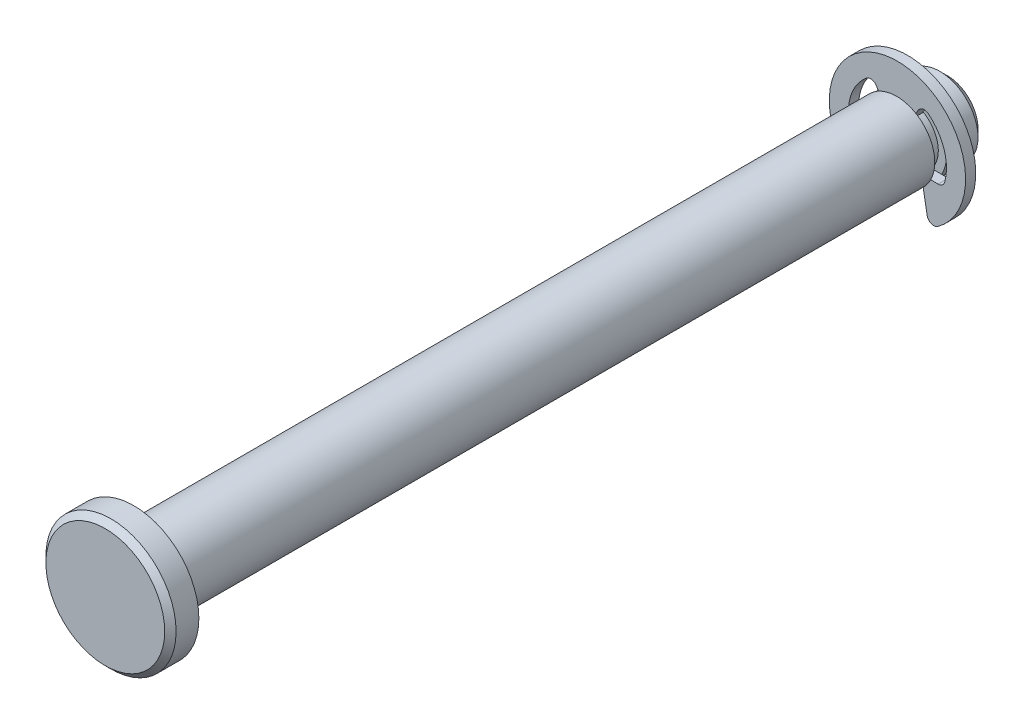
ISO-10303-21;
HEADER;
FILE_DESCRIPTION(('STEP AP214'),'2;1');
FILE_NAME('part.step','',(''),(''),'','','');
FILE_SCHEMA(('AUTOMOTIVE_DESIGN { 1 0 10303 214 1 1 1 1 }'));
ENDSEC;
DATA;
#1=APPLICATION_CONTEXT('core data for automotive mechanical design processes');
#2=APPLICATION_PROTOCOL_DEFINITION('international standard','automotive_design',2000,#1);
#3=PRODUCT_CONTEXT('',#1,'mechanical');
#4=PRODUCT('Part','Part','',(#3));
#5=PRODUCT_RELATED_PRODUCT_CATEGORY('part','',(#4));
#6=PRODUCT_DEFINITION_FORMATION('','',#4);
#7=PRODUCT_DEFINITION_CONTEXT('part definition',#1,'design');
#8=PRODUCT_DEFINITION('design','',#6,#7);
#9=PRODUCT_DEFINITION_SHAPE('','',#8);
#10=(LENGTH_UNIT() NAMED_UNIT(*) SI_UNIT(.MILLI.,.METRE.));
#11=(NAMED_UNIT(*) PLANE_ANGLE_UNIT() SI_UNIT($,.RADIAN.));
#12=(NAMED_UNIT(*) SI_UNIT($,.STERADIAN.) SOLID_ANGLE_UNIT());
#13=UNCERTAINTY_MEASURE_WITH_UNIT(LENGTH_MEASURE(1.E-05),#10,'distance_accuracy_value','');
#14=(GEOMETRIC_REPRESENTATION_CONTEXT(3) GLOBAL_UNCERTAINTY_ASSIGNED_CONTEXT((#13)) GLOBAL_UNIT_ASSIGNED_CONTEXT((#10,
#11,#12)) REPRESENTATION_CONTEXT('',''));
#15=CARTESIAN_POINT('',(0.,0.,0.));
#16=DIRECTION('',(0.,0.,1.));
#17=DIRECTION('',(1.,0.,0.));
#18=AXIS2_PLACEMENT_3D('',#15,#16,#17);
#19=CARTESIAN_POINT('',(0.,0.,-22.2758));
#20=DIRECTION('',(0.,0.,1.));
#21=DIRECTION('',(1.,0.,0.));
#22=AXIS2_PLACEMENT_3D('',#19,#20,#21);
#23=PLANE('',#22);
#24=DIRECTION('',(-0.173648177666931,0.984807753012208,0.));
#25=VECTOR('',#24,1.);
#26=CARTESIAN_POINT('',(1.25692963982568,0.22163060835344,-22.2758));
#27=LINE('',#26,#25);
#28=CARTESIAN_POINT('',(1.85256069501915,-3.15636096616503,-22.2758));
#29=VERTEX_POINT('',#28);
#30=CARTESIAN_POINT('',(1.49352,-1.12014,-22.2758));
#31=VERTEX_POINT('',#30);
#32=EDGE_CURVE('E203',#29,#31,#27,.T.);
#33=ORIENTED_EDGE('',*,*,#32,.F.);
#34=CARTESIAN_POINT('',(2.2715471535382,-3.08248234897663,-22.2758));
#35=DIRECTION('',(0.,0.,1.));
#36=DIRECTION('',(1.,0.,0.));
#37=AXIS2_PLACEMENT_3D('',#34,#35,#36);
#38=CIRCLE('',#37,0.42545);
#39=CARTESIAN_POINT('',(2.52394128170911,-3.42498038775182,-22.2758));
#40=VERTEX_POINT('',#39);
#41=EDGE_CURVE('E257',#29,#40,#38,.T.);
#42=ORIENTED_EDGE('',*,*,#41,.T.);
#43=CARTESIAN_POINT('',(0.,0.,-22.2758));
#44=DIRECTION('',(0.,0.,1.));
#45=DIRECTION('',(1.,0.,0.));
#46=AXIS2_PLACEMENT_3D('',#43,#44,#45);
#47=CIRCLE('',#46,4.2545);
#48=CARTESIAN_POINT('',(-2.52394128170911,-3.42498038775182,-22.2758));
#49=VERTEX_POINT('',#48);
#50=EDGE_CURVE('E183',#40,#49,#47,.T.);
#51=ORIENTED_EDGE('',*,*,#50,.T.);
#52=CARTESIAN_POINT('',(-2.2715471535382,-3.08248234897663,-22.2758));
#53=DIRECTION('',(0.,0.,1.));
#54=DIRECTION('',(1.,0.,0.));
#55=AXIS2_PLACEMENT_3D('',#52,#53,#54);
#56=CIRCLE('',#55,0.42545);
#57=CARTESIAN_POINT('',(-1.85256069501915,-3.15636096616503,-22.2758));
#58=VERTEX_POINT('',#57);
#59=EDGE_CURVE('E255',#49,#58,#56,.T.);
#60=ORIENTED_EDGE('',*,*,#59,.T.);
#61=DIRECTION('',(-0.173648177666931,-0.984807753012208,0.));
#62=VECTOR('',#61,1.);
#63=CARTESIAN_POINT('',(-1.25692963982568,0.22163060835344,-22.2758));
#64=LINE('',#63,#62);
#65=CARTESIAN_POINT('',(-1.49352,-1.12014,-22.2758));
#66=VERTEX_POINT('',#65);
#67=EDGE_CURVE('E199',#66,#58,#64,.T.);
#68=ORIENTED_EDGE('',*,*,#67,.F.);
#69=DIRECTION('',(1.,0.,0.));
#70=VECTOR('',#69,1.);
#71=CARTESIAN_POINT('',(0.,-1.12014,-22.2758));
#72=LINE('',#71,#70);
#73=CARTESIAN_POINT('',(-2.54203626378539,-1.12014,-22.2758));
#74=VERTEX_POINT('',#73);
#75=EDGE_CURVE('E190',#74,#66,#72,.T.);
#76=ORIENTED_EDGE('',*,*,#75,.F.);
#77=CARTESIAN_POINT('',(-2.54203626378539,-0.69469,-22.2758));
#78=DIRECTION('',(0.,0.,1.));
#79=DIRECTION('',(1.,0.,0.));
#80=AXIS2_PLACEMENT_3D('',#77,#78,#79);
#81=CIRCLE('',#80,0.42545);
#82=CARTESIAN_POINT('',(-2.95243729914352,-0.806844771084337,-22.2758));
#83=VERTEX_POINT('',#82);
#84=EDGE_CURVE('E55',#74,#83,#81,.F.);
#85=ORIENTED_EDGE('',*,*,#84,.T.);
#86=CARTESIAN_POINT('',(0.,0.,-22.2758));
#87=DIRECTION('',(0.,0.,1.));
#88=DIRECTION('',(1.,0.,0.));
#89=AXIS2_PLACEMENT_3D('',#86,#87,#88);
#90=CIRCLE('',#89,3.0607);
#91=CARTESIAN_POINT('',(-1.93820951958955,2.36880314677528,-22.2758));
#92=VERTEX_POINT('',#91);
#93=EDGE_CURVE('E215',#92,#83,#90,.T.);
#94=ORIENTED_EDGE('',*,*,#93,.F.);
#95=CARTESIAN_POINT('',(-1.66879035400345,2.03952968031481,-22.2758));
#96=DIRECTION('',(0.,0.,1.));
#97=DIRECTION('',(1.,0.,0.));
#98=AXIS2_PLACEMENT_3D('',#95,#96,#97);
#99=CIRCLE('',#98,0.42545);
#100=CARTESIAN_POINT('',(-1.30033984596336,2.25225468031482,-22.2758));
#101=VERTEX_POINT('',#100);
#102=EDGE_CURVE('E187',#92,#101,#99,.F.);
#103=ORIENTED_EDGE('',*,*,#102,.T.);
#104=DIRECTION('',(-0.500000000000002,0.866025403784438,0.));
#105=VECTOR('',#104,1.);
#106=CARTESIAN_POINT('',(0.,0.,-22.2758));
#107=LINE('',#106,#105);
#108=CARTESIAN_POINT('',(-0.933450000000003,1.61678282632517,-22.2758));
#109=VERTEX_POINT('',#108);
#110=EDGE_CURVE('E179',#109,#101,#107,.T.);
#111=ORIENTED_EDGE('',*,*,#110,.F.);
#112=DIRECTION('',(1.,0.,0.));
#113=VECTOR('',#112,1.);
#114=CARTESIAN_POINT('',(-0.933450000000003,1.61678282632517,-22.2758));
#115=LINE('',#114,#113);
#116=CARTESIAN_POINT('',(0.933450000000003,1.61678282632517,-22.2758));
#117=VERTEX_POINT('',#116);
#118=EDGE_CURVE('E163',#109,#117,#115,.T.);
#119=ORIENTED_EDGE('',*,*,#118,.T.);
#120=DIRECTION('',(-0.500000000000002,-0.866025403784438,0.));
#121=VECTOR('',#120,1.);
#122=CARTESIAN_POINT('',(0.,0.,-22.2758));
#123=LINE('',#122,#121);
#124=CARTESIAN_POINT('',(1.30033984596336,2.25225468031482,-22.2758));
#125=VERTEX_POINT('',#124);
#126=EDGE_CURVE('E213',#125,#117,#123,.T.);
#127=ORIENTED_EDGE('',*,*,#126,.F.);
#128=CARTESIAN_POINT('',(1.66879035400345,2.03952968031482,-22.2758));
#129=DIRECTION('',(0.,0.,1.));
#130=DIRECTION('',(1.,0.,0.));
#131=AXIS2_PLACEMENT_3D('',#128,#129,#130);
#132=CIRCLE('',#131,0.42545);
#133=CARTESIAN_POINT('',(1.93820951958955,2.36880314677528,-22.2758));
#134=VERTEX_POINT('',#133);
#135=EDGE_CURVE('E272',#125,#134,#132,.F.);
#136=ORIENTED_EDGE('',*,*,#135,.T.);
#137=CARTESIAN_POINT('',(0.,0.,-22.2758));
#138=DIRECTION('',(0.,0.,1.));
#139=DIRECTION('',(1.,0.,0.));
#140=AXIS2_PLACEMENT_3D('',#137,#138,#139);
#141=CIRCLE('',#140,3.0607);
#142=CARTESIAN_POINT('',(2.95243729914352,-0.806844771084337,-22.2758));
#143=VERTEX_POINT('',#142);
#144=EDGE_CURVE('E218',#143,#134,#141,.T.);
#145=ORIENTED_EDGE('',*,*,#144,.F.);
#146=CARTESIAN_POINT('',(2.54203626378539,-0.69469,-22.2758));
#147=DIRECTION('',(0.,0.,1.));
#148=DIRECTION('',(1.,0.,0.));
#149=AXIS2_PLACEMENT_3D('',#146,#147,#148);
#150=CIRCLE('',#149,0.42545);
#151=CARTESIAN_POINT('',(2.54203626378539,-1.12014,-22.2758));
#152=VERTEX_POINT('',#151);
#153=EDGE_CURVE('E268',#143,#152,#150,.F.);
#154=ORIENTED_EDGE('',*,*,#153,.T.);
#155=DIRECTION('',(1.,0.,0.));
#156=VECTOR('',#155,1.);
#157=CARTESIAN_POINT('',(0.,-1.12014,-22.2758));
#158=LINE('',#157,#156);
#159=EDGE_CURVE('E208',#31,#152,#158,.T.);
#160=ORIENTED_EDGE('',*,*,#159,.F.);
#161=EDGE_LOOP('',(#33,#42,#51,#60,#68,#76,#85,#94,#103,#111,#119,#127,#136,#145,#154,#160));
#162=FACE_BOUND('',#161,.T.);
#163=ADVANCED_FACE('F47',(#162),#23,.T.);
#164=CARTESIAN_POINT('',(0.,0.,-22.9108));
#165=DIRECTION('',(0.,0.,1.));
#166=DIRECTION('',(1.,0.,0.));
#167=AXIS2_PLACEMENT_3D('',#164,#165,#166);
#168=PLANE('',#167);
#169=CARTESIAN_POINT('',(0.,0.,-22.9108));
#170=DIRECTION('',(0.,0.,1.));
#171=DIRECTION('',(1.,0.,0.));
#172=AXIS2_PLACEMENT_3D('',#169,#170,#171);
#173=CIRCLE('',#172,4.2545);
#174=CARTESIAN_POINT('',(2.52394128170911,-3.42498038775182,-22.9108));
#175=VERTEX_POINT('',#174);
#176=CARTESIAN_POINT('',(-2.52394128170911,-3.42498038775182,-22.9108));
#177=VERTEX_POINT('',#176);
#178=EDGE_CURVE('E221',#175,#177,#173,.T.);
#179=ORIENTED_EDGE('',*,*,#178,.F.);
#180=CARTESIAN_POINT('',(2.2715471535382,-3.08248234897663,-22.9108));
#181=DIRECTION('',(0.,0.,1.));
#182=DIRECTION('',(1.,0.,0.));
#183=AXIS2_PLACEMENT_3D('',#180,#181,#182);
#184=CIRCLE('',#183,0.42545);
#185=CARTESIAN_POINT('',(1.85256069501915,-3.15636096616503,-22.9108));
#186=VERTEX_POINT('',#185);
#187=EDGE_CURVE('E265',#175,#186,#184,.F.);
#188=ORIENTED_EDGE('',*,*,#187,.T.);
#189=DIRECTION('',(-0.173648177666931,0.984807753012208,0.));
#190=VECTOR('',#189,1.);
#191=CARTESIAN_POINT('',(1.25692963982568,0.22163060835344,-22.9108));
#192=LINE('',#191,#190);
#193=CARTESIAN_POINT('',(1.49352,-1.12014,-22.9108));
#194=VERTEX_POINT('',#193);
#195=EDGE_CURVE('E201',#186,#194,#192,.T.);
#196=ORIENTED_EDGE('',*,*,#195,.T.);
#197=DIRECTION('',(1.,0.,0.));
#198=VECTOR('',#197,1.);
#199=CARTESIAN_POINT('',(0.,-1.12014,-22.9108));
#200=LINE('',#199,#198);
#201=CARTESIAN_POINT('',(2.54203626378539,-1.12014,-22.9108));
#202=VERTEX_POINT('',#201);
#203=EDGE_CURVE('E205',#194,#202,#200,.T.);
#204=ORIENTED_EDGE('',*,*,#203,.T.);
#205=CARTESIAN_POINT('',(2.54203626378539,-0.69469,-22.9108));
#206=DIRECTION('',(0.,0.,1.));
#207=DIRECTION('',(1.,0.,0.));
#208=AXIS2_PLACEMENT_3D('',#205,#206,#207);
#209=CIRCLE('',#208,0.42545);
#210=CARTESIAN_POINT('',(2.95243729914352,-0.806844771084337,-22.9108));
#211=VERTEX_POINT('',#210);
#212=EDGE_CURVE('E270',#202,#211,#209,.T.);
#213=ORIENTED_EDGE('',*,*,#212,.T.);
#214=CARTESIAN_POINT('',(0.,0.,-22.9108));
#215=DIRECTION('',(0.,0.,1.));
#216=DIRECTION('',(1.,0.,0.));
#217=AXIS2_PLACEMENT_3D('',#214,#215,#216);
#218=CIRCLE('',#217,3.0607);
#219=CARTESIAN_POINT('',(1.93820951958955,2.36880314677528,-22.9108));
#220=VERTEX_POINT('',#219);
#221=EDGE_CURVE('E229',#211,#220,#218,.T.);
#222=ORIENTED_EDGE('',*,*,#221,.T.);
#223=CARTESIAN_POINT('',(1.66879035400345,2.03952968031482,-22.9108));
#224=DIRECTION('',(0.,0.,1.));
#225=DIRECTION('',(1.,0.,0.));
#226=AXIS2_PLACEMENT_3D('',#223,#224,#225);
#227=CIRCLE('',#226,0.42545);
#228=CARTESIAN_POINT('',(1.30033984596336,2.25225468031482,-22.9108));
#229=VERTEX_POINT('',#228);
#230=EDGE_CURVE('E274',#220,#229,#227,.T.);
#231=ORIENTED_EDGE('',*,*,#230,.T.);
#232=DIRECTION('',(-0.500000000000002,-0.866025403784438,0.));
#233=VECTOR('',#232,1.);
#234=CARTESIAN_POINT('',(0.,0.,-22.9108));
#235=LINE('',#234,#233);
#236=CARTESIAN_POINT('',(0.933450000000003,1.61678282632517,-22.9108));
#237=VERTEX_POINT('',#236);
#238=EDGE_CURVE('E211',#229,#237,#235,.T.);
#239=ORIENTED_EDGE('',*,*,#238,.T.);
#240=DIRECTION('',(-1.,0.,0.));
#241=VECTOR('',#240,1.);
#242=CARTESIAN_POINT('',(-0.933450000000003,1.61678282632517,-22.9108));
#243=LINE('',#242,#241);
#244=CARTESIAN_POINT('',(-0.933450000000003,1.61678282632517,-22.9108));
#245=VERTEX_POINT('',#244);
#246=EDGE_CURVE('E174',#237,#245,#243,.T.);
#247=ORIENTED_EDGE('',*,*,#246,.T.);
#248=DIRECTION('',(-0.500000000000002,0.866025403784438,0.));
#249=VECTOR('',#248,1.);
#250=CARTESIAN_POINT('',(0.,0.,-22.9108));
#251=LINE('',#250,#249);
#252=CARTESIAN_POINT('',(-1.30033984596336,2.25225468031482,-22.9108));
#253=VERTEX_POINT('',#252);
#254=EDGE_CURVE('E182',#245,#253,#251,.T.);
#255=ORIENTED_EDGE('',*,*,#254,.T.);
#256=CARTESIAN_POINT('',(-1.66879035400345,2.03952968031481,-22.9108));
#257=DIRECTION('',(0.,0.,1.));
#258=DIRECTION('',(1.,0.,0.));
#259=AXIS2_PLACEMENT_3D('',#256,#257,#258);
#260=CIRCLE('',#259,0.42545);
#261=CARTESIAN_POINT('',(-1.93820951958955,2.36880314677528,-22.9108));
#262=VERTEX_POINT('',#261);
#263=EDGE_CURVE('E277',#253,#262,#260,.T.);
#264=ORIENTED_EDGE('',*,*,#263,.T.);
#265=CARTESIAN_POINT('',(0.,0.,-22.9108));
#266=DIRECTION('',(0.,0.,1.));
#267=DIRECTION('',(1.,0.,0.));
#268=AXIS2_PLACEMENT_3D('',#265,#266,#267);
#269=CIRCLE('',#268,3.0607);
#270=CARTESIAN_POINT('',(-2.95243729914352,-0.806844771084337,-22.9108));
#271=VERTEX_POINT('',#270);
#272=EDGE_CURVE('E226',#262,#271,#269,.T.);
#273=ORIENTED_EDGE('',*,*,#272,.T.);
#274=CARTESIAN_POINT('',(-2.54203626378539,-0.69469,-22.9108));
#275=DIRECTION('',(0.,0.,1.));
#276=DIRECTION('',(1.,0.,0.));
#277=AXIS2_PLACEMENT_3D('',#274,#275,#276);
#278=CIRCLE('',#277,0.42545);
#279=CARTESIAN_POINT('',(-2.54203626378539,-1.12014,-22.9108));
#280=VERTEX_POINT('',#279);
#281=EDGE_CURVE('E12',#271,#280,#278,.T.);
#282=ORIENTED_EDGE('',*,*,#281,.T.);
#283=DIRECTION('',(1.,0.,0.));
#284=VECTOR('',#283,1.);
#285=CARTESIAN_POINT('',(0.,-1.12014,-22.9108));
#286=LINE('',#285,#284);
#287=CARTESIAN_POINT('',(-1.49352,-1.12014,-22.9108));
#288=VERTEX_POINT('',#287);
#289=EDGE_CURVE('E188',#280,#288,#286,.T.);
#290=ORIENTED_EDGE('',*,*,#289,.T.);
#291=DIRECTION('',(-0.173648177666931,-0.984807753012208,0.));
#292=VECTOR('',#291,1.);
#293=CARTESIAN_POINT('',(-1.25692963982568,0.22163060835344,-22.9108));
#294=LINE('',#293,#292);
#295=CARTESIAN_POINT('',(-1.85256069501915,-3.15636096616503,-22.9108));
#296=VERTEX_POINT('',#295);
#297=EDGE_CURVE('E197',#288,#296,#294,.T.);
#298=ORIENTED_EDGE('',*,*,#297,.T.);
#299=CARTESIAN_POINT('',(-2.2715471535382,-3.08248234897663,-22.9108));
#300=DIRECTION('',(0.,0.,1.));
#301=DIRECTION('',(1.,0.,0.));
#302=AXIS2_PLACEMENT_3D('',#299,#300,#301);
#303=CIRCLE('',#302,0.42545);
#304=EDGE_CURVE('E69',#296,#177,#303,.F.);
#305=ORIENTED_EDGE('',*,*,#304,.T.);
#306=EDGE_LOOP('',(#179,#188,#196,#204,#213,#222,#231,#239,#247,#255,#264,#273,#282,#290,#298,#305));
#307=FACE_BOUND('',#306,.T.);
#308=ADVANCED_FACE('F290',(#307),#168,.F.);
#309=CARTESIAN_POINT('',(0.,0.,-22.2758));
#310=DIRECTION('',(0.,0.,-1.));
#311=DIRECTION('',(-1.,0.,0.));
#312=AXIS2_PLACEMENT_3D('',#309,#310,#311);
#313=CYLINDRICAL_SURFACE('',#312,4.2545);
#314=ORIENTED_EDGE('',*,*,#50,.F.);
#315=DIRECTION('',(0.,0.,-1.));
#316=VECTOR('',#315,1.);
#317=CARTESIAN_POINT('',(2.52394128170911,-3.42498038775182,-22.2758));
#318=LINE('',#317,#316);
#319=EDGE_CURVE('E262',#40,#175,#318,.T.);
#320=ORIENTED_EDGE('',*,*,#319,.T.);
#321=ORIENTED_EDGE('',*,*,#178,.T.);
#322=DIRECTION('',(0.,0.,-1.));
#323=VECTOR('',#322,1.);
#324=CARTESIAN_POINT('',(-2.52394128170911,-3.42498038775182,-22.2758));
#325=LINE('',#324,#323);
#326=EDGE_CURVE('E259',#177,#49,#325,.F.);
#327=ORIENTED_EDGE('',*,*,#326,.T.);
#328=EDGE_LOOP('',(#314,#320,#321,#327));
#329=FACE_BOUND('',#328,.T.);
#330=ADVANCED_FACE('F330',(#329),#313,.T.);
#331=CARTESIAN_POINT('',(-1.49352,-1.12014,-25.4));
#332=DIRECTION('',(-0.984807753012208,0.173648177666931,0.));
#333=DIRECTION('',(-0.173648177666931,-0.984807753012208,0.));
#334=AXIS2_PLACEMENT_3D('',#331,#332,#333);
#335=PLANE('',#334);
#336=ORIENTED_EDGE('',*,*,#67,.T.);
#337=DIRECTION('',(0.,0.,-1.));
#338=VECTOR('',#337,1.);
#339=CARTESIAN_POINT('',(-1.85256069501915,-3.15636096616503,-25.4));
#340=LINE('',#339,#338);
#341=EDGE_CURVE('E62',#58,#296,#340,.T.);
#342=ORIENTED_EDGE('',*,*,#341,.T.);
#343=ORIENTED_EDGE('',*,*,#297,.F.);
#344=DIRECTION('',(0.,0.,1.));
#345=VECTOR('',#344,1.);
#346=CARTESIAN_POINT('',(-1.49352,-1.12014,-25.4));
#347=LINE('',#346,#345);
#348=EDGE_CURVE('E295',#288,#66,#347,.T.);
#349=ORIENTED_EDGE('',*,*,#348,.T.);
#350=EDGE_LOOP('',(#336,#342,#343,#349));
#351=FACE_BOUND('',#350,.T.);
#352=ADVANCED_FACE('F335',(#351),#335,.F.);
#353=CARTESIAN_POINT('',(-1.53035,2.65064395336303,-25.4));
#354=DIRECTION('',(0.866025403784438,0.500000000000002,0.));
#355=DIRECTION('',(-0.500000000000002,0.866025403784438,0.));
#356=AXIS2_PLACEMENT_3D('',#353,#354,#355);
#357=PLANE('',#356);
#358=ORIENTED_EDGE('',*,*,#110,.T.);
#359=DIRECTION('',(0.,0.,-1.));
#360=VECTOR('',#359,1.);
#361=CARTESIAN_POINT('',(-1.30033984596336,2.25225468031482,-22.9108));
#362=LINE('',#361,#360);
#363=EDGE_CURVE('E247',#101,#253,#362,.T.);
#364=ORIENTED_EDGE('',*,*,#363,.T.);
#365=ORIENTED_EDGE('',*,*,#254,.F.);
#366=DIRECTION('',(0.,0.,-1.));
#367=VECTOR('',#366,1.);
#368=CARTESIAN_POINT('',(-0.933450000000003,1.61678282632517,-22.2758));
#369=LINE('',#368,#367);
#370=EDGE_CURVE('E167',#245,#109,#369,.F.);
#371=ORIENTED_EDGE('',*,*,#370,.T.);
#372=EDGE_LOOP('',(#358,#364,#365,#371));
#373=FACE_BOUND('',#372,.T.);
#374=ADVANCED_FACE('F178',(#373),#357,.F.);
#375=CARTESIAN_POINT('',(0.,0.,-25.4));
#376=DIRECTION('',(0.,0.,1.));
#377=DIRECTION('',(1.,0.,0.));
#378=AXIS2_PLACEMENT_3D('',#375,#376,#377);
#379=CYLINDRICAL_SURFACE('',#378,3.0607);
#380=ORIENTED_EDGE('',*,*,#272,.F.);
#381=DIRECTION('',(0.,0.,1.));
#382=VECTOR('',#381,1.);
#383=CARTESIAN_POINT('',(-1.93820951958955,2.36880314677528,-25.4));
#384=LINE('',#383,#382);
#385=EDGE_CURVE('E244',#262,#92,#384,.T.);
#386=ORIENTED_EDGE('',*,*,#385,.T.);
#387=ORIENTED_EDGE('',*,*,#93,.T.);
#388=DIRECTION('',(0.,0.,1.));
#389=VECTOR('',#388,1.);
#390=CARTESIAN_POINT('',(-2.95243729914352,-0.806844771084337,-25.4));
#391=LINE('',#390,#389);
#392=EDGE_CURVE('E242',#83,#271,#391,.F.);
#393=ORIENTED_EDGE('',*,*,#392,.T.);
#394=EDGE_LOOP('',(#380,#386,#387,#393));
#395=FACE_BOUND('',#394,.T.);
#396=ADVANCED_FACE('F285',(#395),#379,.F.);
#397=CARTESIAN_POINT('',(-2.84836284036989,-1.12014,-25.4));
#398=DIRECTION('',(0.,-1.,0.));
#399=DIRECTION('',(0.,0.,-1.));
#400=AXIS2_PLACEMENT_3D('',#397,#398,#399);
#401=PLANE('',#400);
#402=ORIENTED_EDGE('',*,*,#289,.F.);
#403=DIRECTION('',(0.,0.,-1.));
#404=VECTOR('',#403,1.);
#405=CARTESIAN_POINT('',(-2.54203626378539,-1.12014,-22.2758));
#406=LINE('',#405,#404);
#407=EDGE_CURVE('E249',#280,#74,#406,.F.);
#408=ORIENTED_EDGE('',*,*,#407,.T.);
#409=ORIENTED_EDGE('',*,*,#75,.T.);
#410=ORIENTED_EDGE('',*,*,#348,.F.);
#411=EDGE_LOOP('',(#402,#408,#409,#410));
#412=FACE_BOUND('',#411,.T.);
#413=ADVANCED_FACE('F293',(#412),#401,.F.);
#414=CARTESIAN_POINT('',(0.,0.,-25.4));
#415=DIRECTION('',(0.,0.,1.));
#416=DIRECTION('',(1.,0.,0.));
#417=AXIS2_PLACEMENT_3D('',#414,#415,#416);
#418=CYLINDRICAL_SURFACE('',#417,3.0607);
#419=ORIENTED_EDGE('',*,*,#221,.F.);
#420=DIRECTION('',(0.,0.,1.));
#421=VECTOR('',#420,1.);
#422=CARTESIAN_POINT('',(2.95243729914352,-0.806844771084337,-25.4));
#423=LINE('',#422,#421);
#424=EDGE_CURVE('E234',#211,#143,#423,.T.);
#425=ORIENTED_EDGE('',*,*,#424,.T.);
#426=ORIENTED_EDGE('',*,*,#144,.T.);
#427=DIRECTION('',(0.,0.,1.));
#428=VECTOR('',#427,1.);
#429=CARTESIAN_POINT('',(1.93820951958955,2.36880314677528,-25.4));
#430=LINE('',#429,#428);
#431=EDGE_CURVE('E232',#134,#220,#430,.F.);
#432=ORIENTED_EDGE('',*,*,#431,.T.);
#433=EDGE_LOOP('',(#419,#425,#426,#432));
#434=FACE_BOUND('',#433,.T.);
#435=ADVANCED_FACE('F309',(#434),#418,.F.);
#436=CARTESIAN_POINT('',(1.49352,-1.12014,-25.4));
#437=DIRECTION('',(0.,-1.,0.));
#438=DIRECTION('',(0.,0.,-1.));
#439=AXIS2_PLACEMENT_3D('',#436,#437,#438);
#440=PLANE('',#439);
#441=ORIENTED_EDGE('',*,*,#159,.T.);
#442=DIRECTION('',(0.,0.,-1.));
#443=VECTOR('',#442,1.);
#444=CARTESIAN_POINT('',(2.54203626378539,-1.12014,-22.9108));
#445=LINE('',#444,#443);
#446=EDGE_CURVE('E237',#152,#202,#445,.T.);
#447=ORIENTED_EDGE('',*,*,#446,.T.);
#448=ORIENTED_EDGE('',*,*,#203,.F.);
#449=DIRECTION('',(0.,0.,1.));
#450=VECTOR('',#449,1.);
#451=CARTESIAN_POINT('',(1.49352,-1.12014,-25.4));
#452=LINE('',#451,#450);
#453=EDGE_CURVE('E192',#194,#31,#452,.T.);
#454=ORIENTED_EDGE('',*,*,#453,.T.);
#455=EDGE_LOOP('',(#441,#447,#448,#454));
#456=FACE_BOUND('',#455,.T.);
#457=ADVANCED_FACE('F319',(#456),#440,.F.);
#458=CARTESIAN_POINT('',(1.49352,-1.12014,-25.4));
#459=DIRECTION('',(0.984807753012208,0.173648177666931,0.));
#460=DIRECTION('',(-0.173648177666931,0.984807753012208,0.));
#461=AXIS2_PLACEMENT_3D('',#458,#459,#460);
#462=PLANE('',#461);
#463=ORIENTED_EDGE('',*,*,#195,.F.);
#464=DIRECTION('',(0.,0.,-1.));
#465=VECTOR('',#464,1.);
#466=CARTESIAN_POINT('',(1.85256069501915,-3.15636096616503,-25.4));
#467=LINE('',#466,#465);
#468=EDGE_CURVE('E252',#186,#29,#467,.F.);
#469=ORIENTED_EDGE('',*,*,#468,.T.);
#470=ORIENTED_EDGE('',*,*,#32,.T.);
#471=ORIENTED_EDGE('',*,*,#453,.F.);
#472=EDGE_LOOP('',(#463,#469,#470,#471));
#473=FACE_BOUND('',#472,.T.);
#474=ADVANCED_FACE('F324',(#473),#462,.F.);
#475=CARTESIAN_POINT('',(0.,0.,-25.4));
#476=DIRECTION('',(-0.866025403784438,0.500000000000002,0.));
#477=DIRECTION('',(-0.500000000000002,-0.866025403784438,0.));
#478=AXIS2_PLACEMENT_3D('',#475,#476,#477);
#479=PLANE('',#478);
#480=ORIENTED_EDGE('',*,*,#238,.F.);
#481=DIRECTION('',(0.,0.,-1.));
#482=VECTOR('',#481,1.);
#483=CARTESIAN_POINT('',(1.30033984596336,2.25225468031482,-22.2758));
#484=LINE('',#483,#482);
#485=EDGE_CURVE('E239',#229,#125,#484,.F.);
#486=ORIENTED_EDGE('',*,*,#485,.T.);
#487=ORIENTED_EDGE('',*,*,#126,.T.);
#488=DIRECTION('',(0.,0.,-1.));
#489=VECTOR('',#488,1.);
#490=CARTESIAN_POINT('',(0.933450000000003,1.61678282632517,-22.2758));
#491=LINE('',#490,#489);
#492=EDGE_CURVE('E170',#117,#237,#491,.T.);
#493=ORIENTED_EDGE('',*,*,#492,.T.);
#494=EDGE_LOOP('',(#480,#486,#487,#493));
#495=FACE_BOUND('',#494,.T.);
#496=ADVANCED_FACE('F302',(#495),#479,.F.);
#497=CARTESIAN_POINT('',(-0.933450000000003,1.61678282632517,-24.7943801577228));
#498=DIRECTION('',(0.,-1.,0.));
#499=DIRECTION('',(0.,0.,-1.));
#500=AXIS2_PLACEMENT_3D('',#497,#498,#499);
#501=PLANE('',#500);
#502=ORIENTED_EDGE('',*,*,#246,.F.);
#503=ORIENTED_EDGE('',*,*,#492,.F.);
#504=ORIENTED_EDGE('',*,*,#118,.F.);
#505=ORIENTED_EDGE('',*,*,#370,.F.);
#506=EDGE_LOOP('',(#502,#503,#504,#505));
#507=FACE_BOUND('',#506,.T.);
#508=ADVANCED_FACE('F166',(#507),#501,.T.);
#509=CARTESIAN_POINT('',(2.54203626378539,-0.69469,-25.4));
#510=DIRECTION('',(0.,0.,1.));
#511=DIRECTION('',(1.,0.,0.));
#512=AXIS2_PLACEMENT_3D('',#509,#510,#511);
#513=CYLINDRICAL_SURFACE('',#512,0.42545);
#514=ORIENTED_EDGE('',*,*,#212,.F.);
#515=ORIENTED_EDGE('',*,*,#446,.F.);
#516=ORIENTED_EDGE('',*,*,#153,.F.);
#517=ORIENTED_EDGE('',*,*,#424,.F.);
#518=EDGE_LOOP('',(#514,#515,#516,#517));
#519=FACE_BOUND('',#518,.T.);
#520=ADVANCED_FACE('F315',(#519),#513,.F.);
#521=CARTESIAN_POINT('',(1.66879035400345,2.03952968031482,-25.4));
#522=DIRECTION('',(0.,0.,1.));
#523=DIRECTION('',(1.,0.,0.));
#524=AXIS2_PLACEMENT_3D('',#521,#522,#523);
#525=CYLINDRICAL_SURFACE('',#524,0.42545);
#526=ORIENTED_EDGE('',*,*,#230,.F.);
#527=ORIENTED_EDGE('',*,*,#431,.F.);
#528=ORIENTED_EDGE('',*,*,#135,.F.);
#529=ORIENTED_EDGE('',*,*,#485,.F.);
#530=EDGE_LOOP('',(#526,#527,#528,#529));
#531=FACE_BOUND('',#530,.T.);
#532=ADVANCED_FACE('F312',(#531),#525,.F.);
#533=CARTESIAN_POINT('',(-1.66879035400345,2.03952968031481,-25.4));
#534=DIRECTION('',(0.,0.,1.));
#535=DIRECTION('',(1.,0.,0.));
#536=AXIS2_PLACEMENT_3D('',#533,#534,#535);
#537=CYLINDRICAL_SURFACE('',#536,0.42545);
#538=ORIENTED_EDGE('',*,*,#263,.F.);
#539=ORIENTED_EDGE('',*,*,#363,.F.);
#540=ORIENTED_EDGE('',*,*,#102,.F.);
#541=ORIENTED_EDGE('',*,*,#385,.F.);
#542=EDGE_LOOP('',(#538,#539,#540,#541));
#543=FACE_BOUND('',#542,.T.);
#544=ADVANCED_FACE('F358',(#543),#537,.F.);
#545=CARTESIAN_POINT('',(-2.54203626378539,-0.69469,-25.4));
#546=DIRECTION('',(0.,0.,1.));
#547=DIRECTION('',(1.,0.,0.));
#548=AXIS2_PLACEMENT_3D('',#545,#546,#547);
#549=CYLINDRICAL_SURFACE('',#548,0.42545);
#550=ORIENTED_EDGE('',*,*,#281,.F.);
#551=ORIENTED_EDGE('',*,*,#392,.F.);
#552=ORIENTED_EDGE('',*,*,#84,.F.);
#553=ORIENTED_EDGE('',*,*,#407,.F.);
#554=EDGE_LOOP('',(#550,#551,#552,#553));
#555=FACE_BOUND('',#554,.T.);
#556=ADVANCED_FACE('F288',(#555),#549,.F.);
#557=CARTESIAN_POINT('',(2.2715471535382,-3.08248234897663,-22.2758));
#558=DIRECTION('',(0.,0.,-1.));
#559=DIRECTION('',(-1.,0.,0.));
#560=AXIS2_PLACEMENT_3D('',#557,#558,#559);
#561=CYLINDRICAL_SURFACE('',#560,0.42545);
#562=ORIENTED_EDGE('',*,*,#187,.F.);
#563=ORIENTED_EDGE('',*,*,#319,.F.);
#564=ORIENTED_EDGE('',*,*,#41,.F.);
#565=ORIENTED_EDGE('',*,*,#468,.F.);
#566=EDGE_LOOP('',(#562,#563,#564,#565));
#567=FACE_BOUND('',#566,.T.);
#568=ADVANCED_FACE('F333',(#567),#561,.T.);
#569=CARTESIAN_POINT('',(-2.2715471535382,-3.08248234897663,-22.2758));
#570=DIRECTION('',(0.,0.,-1.));
#571=DIRECTION('',(-1.,0.,0.));
#572=AXIS2_PLACEMENT_3D('',#569,#570,#571);
#573=CYLINDRICAL_SURFACE('',#572,0.42545);
#574=ORIENTED_EDGE('',*,*,#304,.F.);
#575=ORIENTED_EDGE('',*,*,#341,.F.);
#576=ORIENTED_EDGE('',*,*,#59,.F.);
#577=ORIENTED_EDGE('',*,*,#326,.F.);
#578=EDGE_LOOP('',(#574,#575,#576,#577));
#579=FACE_BOUND('',#578,.T.);
#580=ADVANCED_FACE('F49',(#579),#573,.T.);
#581=CLOSED_SHELL('',(#163,#308,#330,#352,#374,#396,#413,#435,#457,#474,#496,#508,#520,#532,
#544,#556,#568,#580));
#582=MANIFOLD_SOLID_BREP('B2',#581);
#583=CARTESIAN_POINT('',(0.,0.,25.4));
#584=DIRECTION('',(0.,0.,-1.));
#585=DIRECTION('',(-1.,0.,0.));
#586=AXIS2_PLACEMENT_3D('',#583,#584,#585);
#587=CYLINDRICAL_SURFACE('',#586,2.38125);
#588=CARTESIAN_POINT('',(0.,0.,25.4));
#589=DIRECTION('',(0.,0.,1.));
#590=DIRECTION('',(1.,0.,0.));
#591=AXIS2_PLACEMENT_3D('',#588,#589,#590);
#592=CIRCLE('',#591,2.38125);
#593=CARTESIAN_POINT('',(2.38125,0.,25.4));
#594=VERTEX_POINT('',#593);
#595=EDGE_CURVE('E509',#594,#594,#592,.T.);
#596=ORIENTED_EDGE('',*,*,#595,.F.);
#597=EDGE_LOOP('',(#596));
#598=FACE_BOUND('',#597,.T.);
#599=CARTESIAN_POINT('',(0.,0.,-22.225));
#600=DIRECTION('',(0.,0.,1.));
#601=DIRECTION('',(1.,0.,0.));
#602=AXIS2_PLACEMENT_3D('',#599,#600,#601);
#603=CIRCLE('',#602,2.38125);
#604=CARTESIAN_POINT('',(2.38125,0.,-22.225));
#605=VERTEX_POINT('',#604);
#606=EDGE_CURVE('E521',#605,#605,#603,.T.);
#607=ORIENTED_EDGE('',*,*,#606,.T.);
#608=EDGE_LOOP('',(#607));
#609=FACE_BOUND('',#608,.T.);
#610=ADVANCED_FACE('F489',(#598,#609),#587,.T.);
#611=CARTESIAN_POINT('',(0.,2.38125,-22.225));
#612=DIRECTION('',(0.,0.,-1.));
#613=DIRECTION('',(-1.,0.,0.));
#614=AXIS2_PLACEMENT_3D('',#611,#612,#613);
#615=PLANE('',#614);
#616=CARTESIAN_POINT('',(0.,0.,-22.225));
#617=DIRECTION('',(0.,0.,1.));
#618=DIRECTION('',(1.,0.,0.));
#619=AXIS2_PLACEMENT_3D('',#616,#617,#618);
#620=CIRCLE('',#619,1.8669);
#621=CARTESIAN_POINT('',(1.8669,0.,-22.225));
#622=VERTEX_POINT('',#621);
#623=EDGE_CURVE('E512',#622,#622,#620,.T.);
#624=ORIENTED_EDGE('',*,*,#623,.T.);
#625=EDGE_LOOP('',(#624));
#626=FACE_BOUND('',#625,.T.);
#627=ORIENTED_EDGE('',*,*,#606,.F.);
#628=EDGE_LOOP('',(#627));
#629=FACE_BOUND('',#628,.T.);
#630=ADVANCED_FACE('F539',(#626,#629),#615,.T.);
#631=CARTESIAN_POINT('',(0.,0.,25.4));
#632=DIRECTION('',(0.,0.,1.));
#633=DIRECTION('',(1.,0.,0.));
#634=AXIS2_PLACEMENT_3D('',#631,#632,#633);
#635=CYLINDRICAL_SURFACE('',#634,1.8669);
#636=CARTESIAN_POINT('',(0.,0.,-22.9616));
#637=DIRECTION('',(0.,0.,1.));
#638=DIRECTION('',(1.,0.,0.));
#639=AXIS2_PLACEMENT_3D('',#636,#637,#638);
#640=CIRCLE('',#639,1.8669);
#641=CARTESIAN_POINT('',(1.8669,0.,-22.9616));
#642=VERTEX_POINT('',#641);
#643=EDGE_CURVE('E515',#642,#642,#640,.T.);
#644=ORIENTED_EDGE('',*,*,#643,.T.);
#645=EDGE_LOOP('',(#644));
#646=FACE_BOUND('',#645,.T.);
#647=ORIENTED_EDGE('',*,*,#623,.F.);
#648=EDGE_LOOP('',(#647));
#649=FACE_BOUND('',#648,.T.);
#650=ADVANCED_FACE('F544',(#646,#649),#635,.T.);
#651=CARTESIAN_POINT('',(0.,2.38125,-22.9616));
#652=DIRECTION('',(0.,0.,1.));
#653=DIRECTION('',(1.,0.,0.));
#654=AXIS2_PLACEMENT_3D('',#651,#652,#653);
#655=PLANE('',#654);
#656=CARTESIAN_POINT('',(0.,0.,-22.9616));
#657=DIRECTION('',(0.,0.,1.));
#658=DIRECTION('',(1.,0.,0.));
#659=AXIS2_PLACEMENT_3D('',#656,#657,#658);
#660=CIRCLE('',#659,2.38125);
#661=CARTESIAN_POINT('',(2.38125,0.,-22.9616));
#662=VERTEX_POINT('',#661);
#663=EDGE_CURVE('E518',#662,#662,#660,.T.);
#664=ORIENTED_EDGE('',*,*,#663,.T.);
#665=EDGE_LOOP('',(#664));
#666=FACE_BOUND('',#665,.T.);
#667=ORIENTED_EDGE('',*,*,#643,.F.);
#668=EDGE_LOOP('',(#667));
#669=FACE_BOUND('',#668,.T.);
#670=ADVANCED_FACE('F550',(#666,#669),#655,.T.);
#671=CARTESIAN_POINT('',(0.,0.,-25.4));
#672=DIRECTION('',(0.,0.,1.));
#673=DIRECTION('',(1.,0.,0.));
#674=AXIS2_PLACEMENT_3D('',#671,#672,#673);
#675=PLANE('',#674);
#676=CARTESIAN_POINT('',(0.,0.,-25.4));
#677=DIRECTION('',(0.,0.,1.));
#678=DIRECTION('',(1.,0.,0.));
#679=AXIS2_PLACEMENT_3D('',#676,#677,#678);
#680=CIRCLE('',#679,1.905);
#681=CARTESIAN_POINT('',(1.905,0.,-25.4));
#682=VERTEX_POINT('',#681);
#683=EDGE_CURVE('E46',#682,#682,#680,.F.);
#684=ORIENTED_EDGE('',*,*,#683,.T.);
#685=EDGE_LOOP('',(#684));
#686=FACE_BOUND('',#685,.T.);
#687=ADVANCED_FACE('F555',(#686),#675,.F.);
#688=CARTESIAN_POINT('',(0.,0.,-24.92375));
#689=DIRECTION('',(0.,0.,1.));
#690=DIRECTION('',(1.,0.,0.));
#691=AXIS2_PLACEMENT_3D('',#688,#689,#690);
#692=CIRCLE('',#691,2.38125);
#693=CARTESIAN_POINT('',(2.38125,0.,-24.92375));
#694=VERTEX_POINT('',#693);
#695=EDGE_CURVE('E496',#694,#694,#692,.T.);
#696=ORIENTED_EDGE('',*,*,#695,.T.);
#697=EDGE_LOOP('',(#696));
#698=FACE_BOUND('',#697,.T.);
#699=ORIENTED_EDGE('',*,*,#663,.F.);
#700=EDGE_LOOP('',(#699));
#701=FACE_BOUND('',#700,.T.);
#702=ADVANCED_FACE('F533',(#698,#701),#587,.T.);
#703=CARTESIAN_POINT('',(0.,0.,25.4));
#704=DIRECTION('',(0.,0.,1.));
#705=DIRECTION('',(1.,0.,0.));
#706=AXIS2_PLACEMENT_3D('',#703,#704,#705);
#707=PLANE('',#706);
#708=CARTESIAN_POINT('',(0.,0.,25.4));
#709=DIRECTION('',(0.,0.,1.));
#710=DIRECTION('',(1.,0.,0.));
#711=AXIS2_PLACEMENT_3D('',#708,#709,#710);
#712=CIRCLE('',#711,4.064);
#713=CARTESIAN_POINT('',(4.064,0.,25.4));
#714=VERTEX_POINT('',#713);
#715=EDGE_CURVE('E524',#714,#714,#712,.T.);
#716=ORIENTED_EDGE('',*,*,#715,.F.);
#717=EDGE_LOOP('',(#716));
#718=FACE_BOUND('',#717,.T.);
#719=ORIENTED_EDGE('',*,*,#595,.T.);
#720=EDGE_LOOP('',(#719));
#721=FACE_BOUND('',#720,.T.);
#722=ADVANCED_FACE('F530',(#718,#721),#707,.F.);
#723=CARTESIAN_POINT('',(0.,0.,27.178));
#724=DIRECTION('',(0.,0.,-1.));
#725=DIRECTION('',(-1.,0.,0.));
#726=AXIS2_PLACEMENT_3D('',#723,#724,#725);
#727=CYLINDRICAL_SURFACE('',#726,4.064);
#728=CARTESIAN_POINT('',(0.,0.,26.8224));
#729=DIRECTION('',(0.,0.,1.));
#730=DIRECTION('',(1.,0.,0.));
#731=AXIS2_PLACEMENT_3D('',#728,#729,#730);
#732=CIRCLE('',#731,4.064);
#733=CARTESIAN_POINT('',(4.064,0.,26.8224));
#734=VERTEX_POINT('',#733);
#735=EDGE_CURVE('E500',#734,#734,#732,.F.);
#736=ORIENTED_EDGE('',*,*,#735,.T.);
#737=EDGE_LOOP('',(#736));
#738=FACE_BOUND('',#737,.T.);
#739=ORIENTED_EDGE('',*,*,#715,.T.);
#740=EDGE_LOOP('',(#739));
#741=FACE_BOUND('',#740,.T.);
#742=ADVANCED_FACE('F528',(#738,#741),#727,.T.);
#743=CARTESIAN_POINT('',(0.,0.,27.178));
#744=DIRECTION('',(0.,0.,1.));
#745=DIRECTION('',(1.,0.,0.));
#746=AXIS2_PLACEMENT_3D('',#743,#744,#745);
#747=PLANE('',#746);
#748=CARTESIAN_POINT('',(0.,0.,27.178));
#749=DIRECTION('',(0.,0.,1.));
#750=DIRECTION('',(1.,0.,0.));
#751=AXIS2_PLACEMENT_3D('',#748,#749,#750);
#752=CIRCLE('',#751,3.7084);
#753=CARTESIAN_POINT('',(3.7084,0.,27.178));
#754=VERTEX_POINT('',#753);
#755=EDGE_CURVE('E504',#754,#754,#752,.T.);
#756=ORIENTED_EDGE('',*,*,#755,.T.);
#757=EDGE_LOOP('',(#756));
#758=FACE_BOUND('',#757,.T.);
#759=ADVANCED_FACE('F559',(#758),#747,.T.);
#760=CARTESIAN_POINT('',(0.,0.,27.178));
#761=DIRECTION('',(0.,0.,-1.));
#762=DIRECTION('',(-1.,0.,0.));
#763=AXIS2_PLACEMENT_3D('',#760,#761,#762);
#764=CONICAL_SURFACE('',#763,3.7084,0.785398163397451);
#765=ORIENTED_EDGE('',*,*,#735,.F.);
#766=EDGE_LOOP('',(#765));
#767=FACE_BOUND('',#766,.T.);
#768=ORIENTED_EDGE('',*,*,#755,.F.);
#769=EDGE_LOOP('',(#768));
#770=FACE_BOUND('',#769,.T.);
#771=ADVANCED_FACE('F557',(#767,#770),#764,.T.);
#772=CARTESIAN_POINT('',(0.,0.,-24.92375));
#773=DIRECTION('',(0.,0.,1.));
#774=DIRECTION('',(1.,0.,0.));
#775=AXIS2_PLACEMENT_3D('',#772,#773,#774);
#776=CONICAL_SURFACE('',#775,2.38125,0.785398163397447);
#777=ORIENTED_EDGE('',*,*,#683,.F.);
#778=EDGE_LOOP('',(#777));
#779=FACE_BOUND('',#778,.T.);
#780=ORIENTED_EDGE('',*,*,#695,.F.);
#781=EDGE_LOOP('',(#780));
#782=FACE_BOUND('',#781,.T.);
#783=ADVANCED_FACE('F491',(#779,#782),#776,.T.);
#784=CLOSED_SHELL('',(#610,#630,#650,#670,#687,#702,#722,#742,#759,#771,#783));
#785=MANIFOLD_SOLID_BREP('B6',#784);
#786=ADVANCED_BREP_SHAPE_REPRESENTATION('',(#18,#582,#785),#14);
#787=SHAPE_DEFINITION_REPRESENTATION(#9,#786);
ENDSEC;
END-ISO-10303-21;
